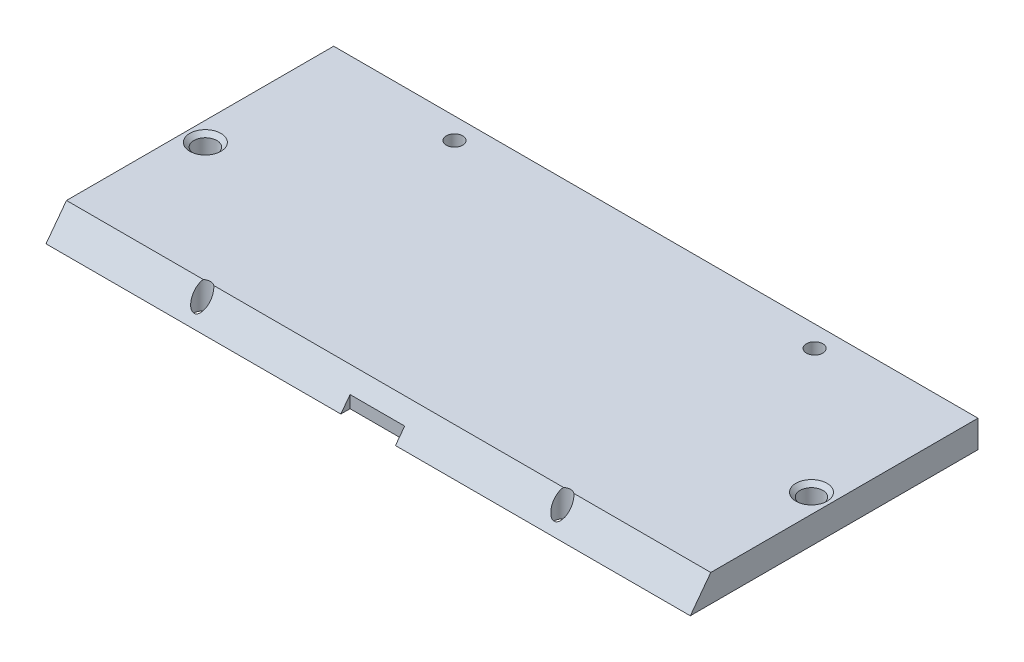
ISO-10303-21;
HEADER;
FILE_DESCRIPTION(('STEP AP214'),'2;1');
FILE_NAME('part.step','',(''),(''),'','','');
FILE_SCHEMA(('AUTOMOTIVE_DESIGN { 1 0 10303 214 1 1 1 1 }'));
ENDSEC;
DATA;
#1=APPLICATION_CONTEXT('core data for automotive mechanical design processes');
#2=APPLICATION_PROTOCOL_DEFINITION('international standard','automotive_design',2000,#1);
#3=PRODUCT_CONTEXT('',#1,'mechanical');
#4=PRODUCT('Part','Part','',(#3));
#5=PRODUCT_RELATED_PRODUCT_CATEGORY('part','',(#4));
#6=PRODUCT_DEFINITION_FORMATION('','',#4);
#7=PRODUCT_DEFINITION_CONTEXT('part definition',#1,'design');
#8=PRODUCT_DEFINITION('design','',#6,#7);
#9=PRODUCT_DEFINITION_SHAPE('','',#8);
#10=(LENGTH_UNIT() NAMED_UNIT(*) SI_UNIT(.MILLI.,.METRE.));
#11=(NAMED_UNIT(*) PLANE_ANGLE_UNIT() SI_UNIT($,.RADIAN.));
#12=(NAMED_UNIT(*) SI_UNIT($,.STERADIAN.) SOLID_ANGLE_UNIT());
#13=UNCERTAINTY_MEASURE_WITH_UNIT(LENGTH_MEASURE(1.E-05),#10,'distance_accuracy_value','');
#14=(GEOMETRIC_REPRESENTATION_CONTEXT(3) GLOBAL_UNCERTAINTY_ASSIGNED_CONTEXT((#13)) GLOBAL_UNIT_ASSIGNED_CONTEXT((#10,
#11,#12)) REPRESENTATION_CONTEXT('',''));
#15=CARTESIAN_POINT('',(0.,0.,0.));
#16=DIRECTION('',(0.,0.,1.));
#17=DIRECTION('',(1.,0.,0.));
#18=AXIS2_PLACEMENT_3D('',#15,#16,#17);
#19=CARTESIAN_POINT('',(59.,31.6666666666667,-29.));
#20=DIRECTION('',(-1.,0.,0.));
#21=DIRECTION('',(0.,0.,1.));
#22=AXIS2_PLACEMENT_3D('',#19,#20,#21);
#23=PLANE('',#22);
#24=DIRECTION('',(0.,0.,-1.));
#25=VECTOR('',#24,1.);
#26=CARTESIAN_POINT('',(59.,31.6666666666667,-29.));
#27=LINE('',#26,#25);
#28=CARTESIAN_POINT('',(59.,31.6666666666667,19.9375));
#29=VERTEX_POINT('',#28);
#30=CARTESIAN_POINT('',(59.,31.6666666666667,-29.));
#31=VERTEX_POINT('',#30);
#32=EDGE_CURVE('E103',#29,#31,#27,.T.);
#33=ORIENTED_EDGE('',*,*,#32,.F.);
#34=DIRECTION('',(0.,-0.799999999999999,0.600000000000001));
#35=VECTOR('',#34,1.);
#36=CARTESIAN_POINT('',(59.,55.1566666666667,2.3199999999999));
#37=LINE('',#36,#35);
#38=CARTESIAN_POINT('',(59.,26.6666666666667,23.6875));
#39=VERTEX_POINT('',#38);
#40=EDGE_CURVE('E141',#29,#39,#37,.T.);
#41=ORIENTED_EDGE('',*,*,#40,.T.);
#42=DIRECTION('',(0.,0.,-1.));
#43=VECTOR('',#42,1.);
#44=CARTESIAN_POINT('',(59.,26.6666666666667,-29.));
#45=LINE('',#44,#43);
#46=CARTESIAN_POINT('',(59.,26.6666666666667,-29.));
#47=VERTEX_POINT('',#46);
#48=EDGE_CURVE('E89',#39,#47,#45,.T.);
#49=ORIENTED_EDGE('',*,*,#48,.T.);
#50=DIRECTION('',(0.,-1.,0.));
#51=VECTOR('',#50,1.);
#52=CARTESIAN_POINT('',(59.,31.6666666666667,-29.));
#53=LINE('',#52,#51);
#54=EDGE_CURVE('E84',#31,#47,#53,.T.);
#55=ORIENTED_EDGE('',*,*,#54,.F.);
#56=EDGE_LOOP('',(#33,#41,#49,#55));
#57=FACE_BOUND('',#56,.T.);
#58=ADVANCED_FACE('F38',(#57),#23,.F.);
#59=CARTESIAN_POINT('',(59.,31.6666666666667,-29.));
#60=DIRECTION('',(0.,0.,1.));
#61=DIRECTION('',(0.,-1.,0.));
#62=AXIS2_PLACEMENT_3D('',#59,#60,#61);
#63=PLANE('',#62);
#64=DIRECTION('',(-1.,0.,0.));
#65=VECTOR('',#64,1.);
#66=CARTESIAN_POINT('',(59.,26.6666666666667,-29.));
#67=LINE('',#66,#65);
#68=CARTESIAN_POINT('',(-59.,26.6666666666667,-29.));
#69=VERTEX_POINT('',#68);
#70=EDGE_CURVE('E78',#47,#69,#67,.T.);
#71=ORIENTED_EDGE('',*,*,#70,.T.);
#72=DIRECTION('',(0.,-1.,0.));
#73=VECTOR('',#72,1.);
#74=CARTESIAN_POINT('',(-59.,31.6666666666667,-29.));
#75=LINE('',#74,#73);
#76=CARTESIAN_POINT('',(-59.,31.6666666666667,-29.));
#77=VERTEX_POINT('',#76);
#78=EDGE_CURVE('E81',#77,#69,#75,.T.);
#79=ORIENTED_EDGE('',*,*,#78,.F.);
#80=DIRECTION('',(-1.,0.,0.));
#81=VECTOR('',#80,1.);
#82=CARTESIAN_POINT('',(59.,31.6666666666667,-29.));
#83=LINE('',#82,#81);
#84=EDGE_CURVE('E65',#31,#77,#83,.T.);
#85=ORIENTED_EDGE('',*,*,#84,.F.);
#86=ORIENTED_EDGE('',*,*,#54,.T.);
#87=EDGE_LOOP('',(#71,#79,#85,#86));
#88=FACE_BOUND('',#87,.T.);
#89=ADVANCED_FACE('F80',(#88),#63,.F.);
#90=CARTESIAN_POINT('',(-59.,31.6666666666667,-29.));
#91=DIRECTION('',(1.,0.,0.));
#92=DIRECTION('',(0.,0.,-1.));
#93=AXIS2_PLACEMENT_3D('',#90,#91,#92);
#94=PLANE('',#93);
#95=DIRECTION('',(0.,0.,1.));
#96=VECTOR('',#95,1.);
#97=CARTESIAN_POINT('',(-59.,26.6666666666667,-29.));
#98=LINE('',#97,#96);
#99=CARTESIAN_POINT('',(-59.,26.6666666666667,23.6875));
#100=VERTEX_POINT('',#99);
#101=EDGE_CURVE('E88',#69,#100,#98,.T.);
#102=ORIENTED_EDGE('',*,*,#101,.T.);
#103=DIRECTION('',(0.,0.799999999999999,-0.600000000000001));
#104=VECTOR('',#103,1.);
#105=CARTESIAN_POINT('',(-59.,55.1566666666667,2.31999999999992));
#106=LINE('',#105,#104);
#107=CARTESIAN_POINT('',(-59.,31.6666666666667,19.9375));
#108=VERTEX_POINT('',#107);
#109=EDGE_CURVE('E139',#100,#108,#106,.T.);
#110=ORIENTED_EDGE('',*,*,#109,.T.);
#111=DIRECTION('',(0.,0.,1.));
#112=VECTOR('',#111,1.);
#113=CARTESIAN_POINT('',(-59.,31.6666666666667,-29.));
#114=LINE('',#113,#112);
#115=EDGE_CURVE('E96',#77,#108,#114,.T.);
#116=ORIENTED_EDGE('',*,*,#115,.F.);
#117=ORIENTED_EDGE('',*,*,#78,.T.);
#118=EDGE_LOOP('',(#102,#110,#116,#117));
#119=FACE_BOUND('',#118,.T.);
#120=ADVANCED_FACE('F93',(#119),#94,.F.);
#121=CARTESIAN_POINT('',(0.,31.6666666666667,0.));
#122=DIRECTION('',(0.,-1.,0.));
#123=DIRECTION('',(0.,0.,-1.));
#124=AXIS2_PLACEMENT_3D('',#121,#122,#123);
#125=PLANE('',#124);
#126=ORIENTED_EDGE('',*,*,#115,.T.);
#127=DIRECTION('',(1.,0.,0.));
#128=VECTOR('',#127,1.);
#129=CARTESIAN_POINT('',(0.,31.6666666666667,19.9375));
#130=LINE('',#129,#128);
#131=CARTESIAN_POINT('',(-33.9229418494823,31.6666666666667,19.9375));
#132=VERTEX_POINT('',#131);
#133=EDGE_CURVE('E127',#108,#132,#130,.T.);
#134=ORIENTED_EDGE('',*,*,#133,.T.);
#135=CARTESIAN_POINT('',(-32.975,31.6666666666667,21.1));
#136=DIRECTION('',(0.,-1.,0.));
#137=DIRECTION('',(1.,0.,0.));
#138=AXIS2_PLACEMENT_3D('',#135,#136,#137);
#139=CIRCLE('',#138,1.5);
#140=CARTESIAN_POINT('',(-32.0270581505177,31.6666666666667,19.9375));
#141=VERTEX_POINT('',#140);
#142=EDGE_CURVE('E233',#132,#141,#139,.T.);
#143=ORIENTED_EDGE('',*,*,#142,.T.);
#144=CARTESIAN_POINT('',(32.0270581505177,31.6666666666667,19.9375));
#145=VERTEX_POINT('',#144);
#146=EDGE_CURVE('E119',#141,#145,#130,.T.);
#147=ORIENTED_EDGE('',*,*,#146,.T.);
#148=CARTESIAN_POINT('',(32.975,31.6666666666667,21.1));
#149=DIRECTION('',(0.,-1.,0.));
#150=DIRECTION('',(1.,0.,0.));
#151=AXIS2_PLACEMENT_3D('',#148,#149,#150);
#152=CIRCLE('',#151,1.5);
#153=CARTESIAN_POINT('',(33.9229418494823,31.6666666666667,19.9375));
#154=VERTEX_POINT('',#153);
#155=EDGE_CURVE('E227',#154,#145,#152,.F.);
#156=ORIENTED_EDGE('',*,*,#155,.F.);
#157=EDGE_CURVE('E129',#154,#29,#130,.T.);
#158=ORIENTED_EDGE('',*,*,#157,.T.);
#159=ORIENTED_EDGE('',*,*,#32,.T.);
#160=ORIENTED_EDGE('',*,*,#84,.T.);
#161=EDGE_LOOP('',(#126,#134,#143,#147,#156,#158,#159,#160));
#162=FACE_BOUND('',#161,.T.);
#163=CARTESIAN_POINT('',(55.5,31.6666666666667,-1.99999999999997));
#164=DIRECTION('',(0.,1.,0.));
#165=DIRECTION('',(0.,0.,-1.));
#166=AXIS2_PLACEMENT_3D('',#163,#164,#165);
#167=CIRCLE('',#166,2.85);
#168=CARTESIAN_POINT('',(55.5,31.6666666666667,-4.84999999999997));
#169=VERTEX_POINT('',#168);
#170=EDGE_CURVE('E174',#169,#169,#167,.T.);
#171=ORIENTED_EDGE('',*,*,#170,.F.);
#172=EDGE_LOOP('',(#171));
#173=FACE_BOUND('',#172,.T.);
#174=CARTESIAN_POINT('',(-55.5,31.6666666666667,-1.99999999999997));
#175=DIRECTION('',(0.,-1.,0.));
#176=DIRECTION('',(0.,0.,-1.));
#177=AXIS2_PLACEMENT_3D('',#174,#175,#176);
#178=CIRCLE('',#177,2.85);
#179=CARTESIAN_POINT('',(-55.5,31.6666666666667,-4.84999999999997));
#180=VERTEX_POINT('',#179);
#181=EDGE_CURVE('E48',#180,#180,#178,.T.);
#182=ORIENTED_EDGE('',*,*,#181,.T.);
#183=EDGE_LOOP('',(#182));
#184=FACE_BOUND('',#183,.T.);
#185=CARTESIAN_POINT('',(32.975,31.6666666666667,-25.1));
#186=DIRECTION('',(0.,-1.,0.));
#187=DIRECTION('',(1.,0.,0.));
#188=AXIS2_PLACEMENT_3D('',#185,#186,#187);
#189=CIRCLE('',#188,1.5);
#190=CARTESIAN_POINT('',(34.475,31.6666666666667,-25.1));
#191=VERTEX_POINT('',#190);
#192=EDGE_CURVE('E43',#191,#191,#189,.T.);
#193=ORIENTED_EDGE('',*,*,#192,.T.);
#194=EDGE_LOOP('',(#193));
#195=FACE_BOUND('',#194,.T.);
#196=CARTESIAN_POINT('',(-32.975,31.6666666666667,-25.1));
#197=DIRECTION('',(0.,-1.,0.));
#198=DIRECTION('',(1.,0.,0.));
#199=AXIS2_PLACEMENT_3D('',#196,#197,#198);
#200=CIRCLE('',#199,1.5);
#201=CARTESIAN_POINT('',(-31.475,31.6666666666667,-25.1));
#202=VERTEX_POINT('',#201);
#203=EDGE_CURVE('E135',#202,#202,#200,.F.);
#204=ORIENTED_EDGE('',*,*,#203,.F.);
#205=EDGE_LOOP('',(#204));
#206=FACE_BOUND('',#205,.T.);
#207=ADVANCED_FACE('F224',(#162,#173,#184,#195,#206),#125,.F.);
#208=CARTESIAN_POINT('',(0.,26.6666666666667,0.));
#209=DIRECTION('',(0.,-1.,0.));
#210=DIRECTION('',(0.,0.,-1.));
#211=AXIS2_PLACEMENT_3D('',#208,#209,#210);
#212=PLANE('',#211);
#213=DIRECTION('',(-1.,0.,0.));
#214=VECTOR('',#213,1.);
#215=CARTESIAN_POINT('',(65.,26.6666666666667,23.6875));
#216=LINE('',#215,#214);
#217=CARTESIAN_POINT('',(-5.,26.6666666666667,23.6875));
#218=VERTEX_POINT('',#217);
#219=EDGE_CURVE('E102',#218,#100,#216,.T.);
#220=ORIENTED_EDGE('',*,*,#219,.T.);
#221=ORIENTED_EDGE('',*,*,#101,.F.);
#222=ORIENTED_EDGE('',*,*,#70,.F.);
#223=ORIENTED_EDGE('',*,*,#48,.F.);
#224=CARTESIAN_POINT('',(5.,26.6666666666667,23.6875));
#225=VERTEX_POINT('',#224);
#226=EDGE_CURVE('E120',#39,#225,#216,.T.);
#227=ORIENTED_EDGE('',*,*,#226,.T.);
#228=DIRECTION('',(0.,0.,1.));
#229=VECTOR('',#228,1.);
#230=CARTESIAN_POINT('',(5.,26.6666666666667,0.));
#231=LINE('',#230,#229);
#232=CARTESIAN_POINT('',(5.,26.6666666666667,22.));
#233=VERTEX_POINT('',#232);
#234=EDGE_CURVE('E11',#233,#225,#231,.T.);
#235=ORIENTED_EDGE('',*,*,#234,.F.);
#236=DIRECTION('',(-1.,0.,0.));
#237=VECTOR('',#236,1.);
#238=CARTESIAN_POINT('',(-5.,26.6666666666667,22.));
#239=LINE('',#238,#237);
#240=CARTESIAN_POINT('',(-5.,26.6666666666667,22.));
#241=VERTEX_POINT('',#240);
#242=EDGE_CURVE('E167',#233,#241,#239,.T.);
#243=ORIENTED_EDGE('',*,*,#242,.T.);
#244=DIRECTION('',(0.,0.,1.));
#245=VECTOR('',#244,1.);
#246=CARTESIAN_POINT('',(-5.,26.6666666666667,28.));
#247=LINE('',#246,#245);
#248=EDGE_CURVE('E56',#241,#218,#247,.T.);
#249=ORIENTED_EDGE('',*,*,#248,.T.);
#250=EDGE_LOOP('',(#220,#221,#222,#223,#227,#235,#243,#249));
#251=FACE_BOUND('',#250,.T.);
#252=CARTESIAN_POINT('',(-32.975,26.6666666666667,21.1));
#253=DIRECTION('',(0.,-1.,0.));
#254=DIRECTION('',(0.,0.,-1.));
#255=AXIS2_PLACEMENT_3D('',#252,#253,#254);
#256=CIRCLE('',#255,1.5);
#257=CARTESIAN_POINT('',(-32.975,26.6666666666667,19.6));
#258=VERTEX_POINT('',#257);
#259=EDGE_CURVE('E155',#258,#258,#256,.T.);
#260=ORIENTED_EDGE('',*,*,#259,.F.);
#261=EDGE_LOOP('',(#260));
#262=FACE_BOUND('',#261,.T.);
#263=CARTESIAN_POINT('',(32.975,26.6666666666667,21.1));
#264=DIRECTION('',(0.,1.,0.));
#265=DIRECTION('',(0.,0.,-1.));
#266=AXIS2_PLACEMENT_3D('',#263,#264,#265);
#267=CIRCLE('',#266,1.5);
#268=CARTESIAN_POINT('',(32.975,26.6666666666667,19.6));
#269=VERTEX_POINT('',#268);
#270=EDGE_CURVE('E158',#269,#269,#267,.T.);
#271=ORIENTED_EDGE('',*,*,#270,.T.);
#272=EDGE_LOOP('',(#271));
#273=FACE_BOUND('',#272,.T.);
#274=CARTESIAN_POINT('',(32.975,26.6666666666667,-25.1));
#275=DIRECTION('',(0.,-1.,0.));
#276=DIRECTION('',(0.,0.,1.));
#277=AXIS2_PLACEMENT_3D('',#274,#275,#276);
#278=CIRCLE('',#277,1.5);
#279=CARTESIAN_POINT('',(32.975,26.6666666666667,-23.6));
#280=VERTEX_POINT('',#279);
#281=EDGE_CURVE('E161',#280,#280,#278,.T.);
#282=ORIENTED_EDGE('',*,*,#281,.F.);
#283=EDGE_LOOP('',(#282));
#284=FACE_BOUND('',#283,.T.);
#285=CARTESIAN_POINT('',(-32.975,26.6666666666667,-25.1));
#286=DIRECTION('',(0.,1.,0.));
#287=DIRECTION('',(0.,0.,1.));
#288=AXIS2_PLACEMENT_3D('',#285,#286,#287);
#289=CIRCLE('',#288,1.5);
#290=CARTESIAN_POINT('',(-32.975,26.6666666666667,-23.6));
#291=VERTEX_POINT('',#290);
#292=EDGE_CURVE('E164',#291,#291,#289,.T.);
#293=ORIENTED_EDGE('',*,*,#292,.T.);
#294=EDGE_LOOP('',(#293));
#295=FACE_BOUND('',#294,.T.);
#296=CARTESIAN_POINT('',(55.5,26.6666666666667,-1.99999999999997));
#297=DIRECTION('',(0.,1.,0.));
#298=DIRECTION('',(0.,0.,-1.));
#299=AXIS2_PLACEMENT_3D('',#296,#297,#298);
#300=CIRCLE('',#299,2.1);
#301=CARTESIAN_POINT('',(55.5,26.6666666666667,-4.09999999999997));
#302=VERTEX_POINT('',#301);
#303=EDGE_CURVE('E179',#302,#302,#300,.T.);
#304=ORIENTED_EDGE('',*,*,#303,.T.);
#305=EDGE_LOOP('',(#304));
#306=FACE_BOUND('',#305,.T.);
#307=CARTESIAN_POINT('',(-55.5,26.6666666666667,-1.99999999999997));
#308=DIRECTION('',(0.,-1.,0.));
#309=DIRECTION('',(0.,0.,-1.));
#310=AXIS2_PLACEMENT_3D('',#307,#308,#309);
#311=CIRCLE('',#310,2.1);
#312=CARTESIAN_POINT('',(-55.5,26.6666666666667,-4.09999999999997));
#313=VERTEX_POINT('',#312);
#314=EDGE_CURVE('E110',#313,#313,#311,.T.);
#315=ORIENTED_EDGE('',*,*,#314,.F.);
#316=EDGE_LOOP('',(#315));
#317=FACE_BOUND('',#316,.T.);
#318=ADVANCED_FACE('F99',(#251,#262,#273,#284,#295,#306,#317),#212,.T.);
#319=CARTESIAN_POINT('',(-55.5,10.9968181856833,-1.99999999999997));
#320=DIRECTION('',(0.,1.,0.));
#321=DIRECTION('',(0.,0.,1.));
#322=AXIS2_PLACEMENT_3D('',#319,#320,#321);
#323=CYLINDRICAL_SURFACE('',#322,2.1);
#324=CARTESIAN_POINT('',(-55.5,30.9166666666667,-1.99999999999997));
#325=DIRECTION('',(0.,-1.,0.));
#326=DIRECTION('',(0.,0.,-1.));
#327=AXIS2_PLACEMENT_3D('',#324,#325,#326);
#328=CIRCLE('',#327,2.1);
#329=CARTESIAN_POINT('',(-55.5,30.9166666666667,-4.09999999999997));
#330=VERTEX_POINT('',#329);
#331=EDGE_CURVE('E109',#330,#330,#328,.F.);
#332=ORIENTED_EDGE('',*,*,#331,.T.);
#333=EDGE_LOOP('',(#332));
#334=FACE_BOUND('',#333,.T.);
#335=ORIENTED_EDGE('',*,*,#314,.T.);
#336=EDGE_LOOP('',(#335));
#337=FACE_BOUND('',#336,.T.);
#338=ADVANCED_FACE('F245',(#334,#337),#323,.F.);
#339=CARTESIAN_POINT('',(-55.5,30.9166666666667,-1.99999999999997));
#340=DIRECTION('',(0.,1.,0.));
#341=DIRECTION('',(0.,0.,1.));
#342=AXIS2_PLACEMENT_3D('',#339,#340,#341);
#343=CONICAL_SURFACE('',#342,2.1,0.785398163397453);
#344=ORIENTED_EDGE('',*,*,#181,.F.);
#345=EDGE_LOOP('',(#344));
#346=FACE_BOUND('',#345,.T.);
#347=ORIENTED_EDGE('',*,*,#331,.F.);
#348=EDGE_LOOP('',(#347));
#349=FACE_BOUND('',#348,.T.);
#350=ADVANCED_FACE('F41',(#346,#349),#343,.F.);
#351=CARTESIAN_POINT('',(55.5,10.9968181856833,-1.99999999999997));
#352=DIRECTION('',(0.,1.,0.));
#353=DIRECTION('',(0.,0.,1.));
#354=AXIS2_PLACEMENT_3D('',#351,#352,#353);
#355=CYLINDRICAL_SURFACE('',#354,2.1);
#356=CARTESIAN_POINT('',(55.5,30.9166666666667,-1.99999999999997));
#357=DIRECTION('',(0.,1.,0.));
#358=DIRECTION('',(0.,0.,-1.));
#359=AXIS2_PLACEMENT_3D('',#356,#357,#358);
#360=CIRCLE('',#359,2.1);
#361=CARTESIAN_POINT('',(55.5,30.9166666666667,-4.09999999999997));
#362=VERTEX_POINT('',#361);
#363=EDGE_CURVE('E113',#362,#362,#360,.F.);
#364=ORIENTED_EDGE('',*,*,#363,.F.);
#365=EDGE_LOOP('',(#364));
#366=FACE_BOUND('',#365,.T.);
#367=ORIENTED_EDGE('',*,*,#303,.F.);
#368=EDGE_LOOP('',(#367));
#369=FACE_BOUND('',#368,.T.);
#370=ADVANCED_FACE('F263',(#366,#369),#355,.F.);
#371=CARTESIAN_POINT('',(55.5,30.9166666666667,-1.99999999999997));
#372=DIRECTION('',(0.,1.,0.));
#373=DIRECTION('',(0.,0.,1.));
#374=AXIS2_PLACEMENT_3D('',#371,#372,#373);
#375=CONICAL_SURFACE('',#374,2.1,0.785398163397453);
#376=ORIENTED_EDGE('',*,*,#170,.T.);
#377=EDGE_LOOP('',(#376));
#378=FACE_BOUND('',#377,.T.);
#379=ORIENTED_EDGE('',*,*,#363,.T.);
#380=EDGE_LOOP('',(#379));
#381=FACE_BOUND('',#380,.T.);
#382=ADVANCED_FACE('F306',(#378,#381),#375,.F.);
#383=CARTESIAN_POINT('',(5.,26.6666666666667,28.));
#384=DIRECTION('',(1.,0.,0.));
#385=DIRECTION('',(0.,0.,-1.));
#386=AXIS2_PLACEMENT_3D('',#383,#384,#385);
#387=PLANE('',#386);
#388=ORIENTED_EDGE('',*,*,#234,.T.);
#389=DIRECTION('',(0.,0.799999999999999,-0.600000000000001));
#390=VECTOR('',#389,1.);
#391=CARTESIAN_POINT('',(5.,24.5966666666667,25.24));
#392=LINE('',#391,#390);
#393=CARTESIAN_POINT('',(5.,28.9166666666666,22.));
#394=VERTEX_POINT('',#393);
#395=EDGE_CURVE('E152',#225,#394,#392,.T.);
#396=ORIENTED_EDGE('',*,*,#395,.T.);
#397=DIRECTION('',(0.,1.,0.));
#398=VECTOR('',#397,1.);
#399=CARTESIAN_POINT('',(5.,26.6666666666667,22.));
#400=LINE('',#399,#398);
#401=EDGE_CURVE('E171',#233,#394,#400,.T.);
#402=ORIENTED_EDGE('',*,*,#401,.F.);
#403=EDGE_LOOP('',(#388,#396,#402));
#404=FACE_BOUND('',#403,.T.);
#405=ADVANCED_FACE('F214',(#404),#387,.F.);
#406=CARTESIAN_POINT('',(-5.,26.6666666666667,28.));
#407=DIRECTION('',(-1.,0.,0.));
#408=DIRECTION('',(0.,0.,1.));
#409=AXIS2_PLACEMENT_3D('',#406,#407,#408);
#410=PLANE('',#409);
#411=DIRECTION('',(0.,1.,0.));
#412=VECTOR('',#411,1.);
#413=CARTESIAN_POINT('',(-5.,26.6666666666667,22.));
#414=LINE('',#413,#412);
#415=CARTESIAN_POINT('',(-5.,28.9166666666666,22.));
#416=VERTEX_POINT('',#415);
#417=EDGE_CURVE('E172',#241,#416,#414,.T.);
#418=ORIENTED_EDGE('',*,*,#417,.T.);
#419=DIRECTION('',(0.,-0.799999999999999,0.600000000000001));
#420=VECTOR('',#419,1.);
#421=CARTESIAN_POINT('',(-5.,24.5966666666667,25.24));
#422=LINE('',#421,#420);
#423=EDGE_CURVE('E150',#416,#218,#422,.T.);
#424=ORIENTED_EDGE('',*,*,#423,.T.);
#425=ORIENTED_EDGE('',*,*,#248,.F.);
#426=EDGE_LOOP('',(#418,#424,#425));
#427=FACE_BOUND('',#426,.T.);
#428=ADVANCED_FACE('F217',(#427),#410,.F.);
#429=CARTESIAN_POINT('',(-5.,26.6666666666667,22.));
#430=DIRECTION('',(0.,0.,-1.));
#431=DIRECTION('',(0.,1.,0.));
#432=AXIS2_PLACEMENT_3D('',#429,#430,#431);
#433=PLANE('',#432);
#434=ORIENTED_EDGE('',*,*,#401,.T.);
#435=DIRECTION('',(-1.,0.,0.));
#436=VECTOR('',#435,1.);
#437=CARTESIAN_POINT('',(-5.,28.9166666666666,22.));
#438=LINE('',#437,#436);
#439=EDGE_CURVE('E147',#394,#416,#438,.T.);
#440=ORIENTED_EDGE('',*,*,#439,.T.);
#441=ORIENTED_EDGE('',*,*,#417,.F.);
#442=ORIENTED_EDGE('',*,*,#242,.F.);
#443=EDGE_LOOP('',(#434,#440,#441,#442));
#444=FACE_BOUND('',#443,.T.);
#445=ADVANCED_FACE('F216',(#444),#433,.F.);
#446=CARTESIAN_POINT('',(-32.975,26.6666666666667,-25.1));
#447=DIRECTION('',(0.,1.,0.));
#448=DIRECTION('',(0.,0.,1.));
#449=AXIS2_PLACEMENT_3D('',#446,#447,#448);
#450=CYLINDRICAL_SURFACE('',#449,1.5);
#451=ORIENTED_EDGE('',*,*,#203,.T.);
#452=EDGE_LOOP('',(#451));
#453=FACE_BOUND('',#452,.T.);
#454=ORIENTED_EDGE('',*,*,#292,.F.);
#455=EDGE_LOOP('',(#454));
#456=FACE_BOUND('',#455,.T.);
#457=ADVANCED_FACE('F341',(#453,#456),#450,.F.);
#458=CARTESIAN_POINT('',(32.975,26.6666666666667,-25.1));
#459=DIRECTION('',(0.,1.,0.));
#460=DIRECTION('',(0.,0.,1.));
#461=AXIS2_PLACEMENT_3D('',#458,#459,#460);
#462=CYLINDRICAL_SURFACE('',#461,1.5);
#463=ORIENTED_EDGE('',*,*,#192,.F.);
#464=EDGE_LOOP('',(#463));
#465=FACE_BOUND('',#464,.T.);
#466=ORIENTED_EDGE('',*,*,#281,.T.);
#467=EDGE_LOOP('',(#466));
#468=FACE_BOUND('',#467,.T.);
#469=ADVANCED_FACE('F350',(#465,#468),#462,.F.);
#470=CARTESIAN_POINT('',(32.975,26.6666666666667,21.1));
#471=DIRECTION('',(0.,1.,0.));
#472=DIRECTION('',(0.,0.,1.));
#473=AXIS2_PLACEMENT_3D('',#470,#471,#472);
#474=CYLINDRICAL_SURFACE('',#473,1.5);
#475=CARTESIAN_POINT('',(32.975,30.1166666666666,21.1));
#476=DIRECTION('',(0.,-0.600000000000001,-0.799999999999999));
#477=DIRECTION('',(0.,0.799999999999999,-0.600000000000001));
#478=AXIS2_PLACEMENT_3D('',#475,#476,#477);
#479=ELLIPSE('',#478,2.5,1.5);
#480=EDGE_CURVE('E144',#145,#154,#479,.F.);
#481=ORIENTED_EDGE('',*,*,#480,.T.);
#482=ORIENTED_EDGE('',*,*,#155,.T.);
#483=EDGE_LOOP('',(#481,#482));
#484=FACE_BOUND('',#483,.T.);
#485=ORIENTED_EDGE('',*,*,#270,.F.);
#486=EDGE_LOOP('',(#485));
#487=FACE_BOUND('',#486,.T.);
#488=ADVANCED_FACE('F231',(#484,#487),#474,.F.);
#489=CARTESIAN_POINT('',(-32.975,26.6666666666667,21.1));
#490=DIRECTION('',(0.,1.,0.));
#491=DIRECTION('',(0.,0.,1.));
#492=AXIS2_PLACEMENT_3D('',#489,#490,#491);
#493=CYLINDRICAL_SURFACE('',#492,1.5);
#494=ORIENTED_EDGE('',*,*,#142,.F.);
#495=CARTESIAN_POINT('',(-32.975,30.1166666666666,21.1));
#496=DIRECTION('',(0.,-0.600000000000001,-0.799999999999999));
#497=DIRECTION('',(0.,0.799999999999999,-0.600000000000001));
#498=AXIS2_PLACEMENT_3D('',#495,#496,#497);
#499=ELLIPSE('',#498,2.5,1.5);
#500=EDGE_CURVE('E117',#141,#132,#499,.T.);
#501=ORIENTED_EDGE('',*,*,#500,.F.);
#502=EDGE_LOOP('',(#494,#501));
#503=FACE_BOUND('',#502,.T.);
#504=ORIENTED_EDGE('',*,*,#259,.T.);
#505=EDGE_LOOP('',(#504));
#506=FACE_BOUND('',#505,.T.);
#507=ADVANCED_FACE('F238',(#503,#506),#493,.F.);
#508=CARTESIAN_POINT('',(65.,34.1166666666666,18.1));
#509=DIRECTION('',(0.,-0.600000000000001,-0.799999999999999));
#510=DIRECTION('',(0.,0.799999999999999,-0.600000000000001));
#511=AXIS2_PLACEMENT_3D('',#508,#509,#510);
#512=PLANE('',#511);
#513=ORIENTED_EDGE('',*,*,#157,.F.);
#514=ORIENTED_EDGE('',*,*,#480,.F.);
#515=ORIENTED_EDGE('',*,*,#146,.F.);
#516=ORIENTED_EDGE('',*,*,#500,.T.);
#517=ORIENTED_EDGE('',*,*,#133,.F.);
#518=ORIENTED_EDGE('',*,*,#109,.F.);
#519=ORIENTED_EDGE('',*,*,#219,.F.);
#520=ORIENTED_EDGE('',*,*,#423,.F.);
#521=ORIENTED_EDGE('',*,*,#439,.F.);
#522=ORIENTED_EDGE('',*,*,#395,.F.);
#523=ORIENTED_EDGE('',*,*,#226,.F.);
#524=ORIENTED_EDGE('',*,*,#40,.F.);
#525=EDGE_LOOP('',(#513,#514,#515,#516,#517,#518,#519,#520,#521,#522,#523,#524));
#526=FACE_BOUND('',#525,.T.);
#527=ADVANCED_FACE('F218',(#526),#512,.F.);
#528=CLOSED_SHELL('',(#58,#89,#120,#207,#318,#338,#350,#370,#382,#405,#428,#445,#457,#469,#488,
#507,#527));
#529=MANIFOLD_SOLID_BREP('B2',#528);
#530=ADVANCED_BREP_SHAPE_REPRESENTATION('',(#18,#529),#14);
#531=SHAPE_DEFINITION_REPRESENTATION(#9,#530);
ENDSEC;
END-ISO-10303-21;
